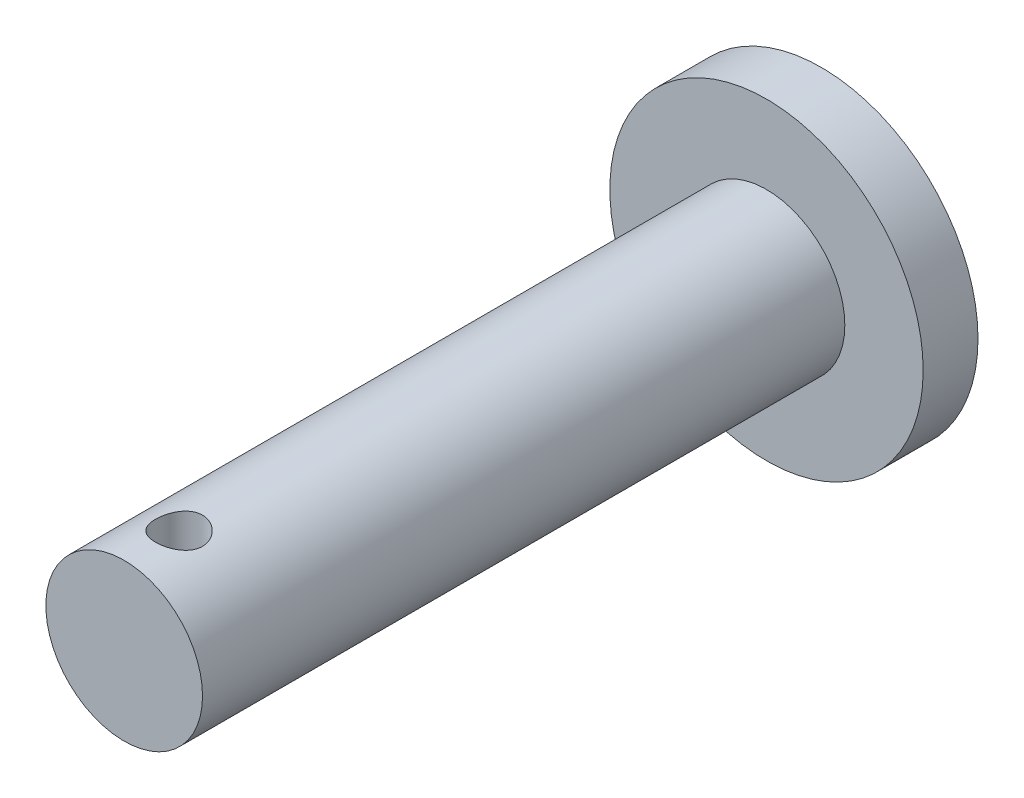
ISO-10303-21;
HEADER;
FILE_DESCRIPTION(('STEP AP214'),'2;1');
FILE_NAME('part.step','',(''),(''),'','','');
FILE_SCHEMA(('AUTOMOTIVE_DESIGN { 1 0 10303 214 1 1 1 1 }'));
ENDSEC;
DATA;
#1=APPLICATION_CONTEXT('core data for automotive mechanical design processes');
#2=APPLICATION_PROTOCOL_DEFINITION('international standard','automotive_design',2000,#1);
#3=PRODUCT_CONTEXT('',#1,'mechanical');
#4=PRODUCT('Part','Part','',(#3));
#5=PRODUCT_RELATED_PRODUCT_CATEGORY('part','',(#4));
#6=PRODUCT_DEFINITION_FORMATION('','',#4);
#7=PRODUCT_DEFINITION_CONTEXT('part definition',#1,'design');
#8=PRODUCT_DEFINITION('design','',#6,#7);
#9=PRODUCT_DEFINITION_SHAPE('','',#8);
#10=(LENGTH_UNIT() NAMED_UNIT(*) SI_UNIT(.MILLI.,.METRE.));
#11=(NAMED_UNIT(*) PLANE_ANGLE_UNIT() SI_UNIT($,.RADIAN.));
#12=(NAMED_UNIT(*) SI_UNIT($,.STERADIAN.) SOLID_ANGLE_UNIT());
#13=UNCERTAINTY_MEASURE_WITH_UNIT(LENGTH_MEASURE(1.E-05),#10,'distance_accuracy_value','');
#14=(GEOMETRIC_REPRESENTATION_CONTEXT(3) GLOBAL_UNCERTAINTY_ASSIGNED_CONTEXT((#13)) GLOBAL_UNIT_ASSIGNED_CONTEXT((#10,
#11,#12)) REPRESENTATION_CONTEXT('',''));
#15=CARTESIAN_POINT('',(0.,0.,0.));
#16=DIRECTION('',(0.,0.,1.));
#17=DIRECTION('',(1.,0.,0.));
#18=AXIS2_PLACEMENT_3D('',#15,#16,#17);
#19=CARTESIAN_POINT('',(0.,0.,7.));
#20=DIRECTION('',(0.,0.,-1.));
#21=DIRECTION('',(-1.,0.,0.));
#22=AXIS2_PLACEMENT_3D('',#19,#20,#21);
#23=CYLINDRICAL_SURFACE('',#22,20.);
#24=CARTESIAN_POINT('',(0.,0.,7.));
#25=DIRECTION('',(0.,0.,1.));
#26=DIRECTION('',(1.,0.,0.));
#27=AXIS2_PLACEMENT_3D('',#24,#25,#26);
#28=CIRCLE('',#27,20.);
#29=CARTESIAN_POINT('',(20.,0.,7.));
#30=VERTEX_POINT('',#29);
#31=EDGE_CURVE('E56',#30,#30,#28,.T.);
#32=ORIENTED_EDGE('',*,*,#31,.F.);
#33=EDGE_LOOP('',(#32));
#34=FACE_BOUND('',#33,.T.);
#35=CARTESIAN_POINT('',(0.,0.,0.));
#36=DIRECTION('',(0.,0.,1.));
#37=DIRECTION('',(1.,0.,0.));
#38=AXIS2_PLACEMENT_3D('',#35,#36,#37);
#39=CIRCLE('',#38,20.);
#40=CARTESIAN_POINT('',(20.,0.,0.));
#41=VERTEX_POINT('',#40);
#42=EDGE_CURVE('E62',#41,#41,#39,.T.);
#43=ORIENTED_EDGE('',*,*,#42,.T.);
#44=EDGE_LOOP('',(#43));
#45=FACE_BOUND('',#44,.T.);
#46=ADVANCED_FACE('F43',(#34,#45),#23,.T.);
#47=CARTESIAN_POINT('',(0.,0.,7.));
#48=DIRECTION('',(0.,0.,1.));
#49=DIRECTION('',(1.,0.,0.));
#50=AXIS2_PLACEMENT_3D('',#47,#48,#49);
#51=PLANE('',#50);
#52=CARTESIAN_POINT('',(0.,0.,7.));
#53=DIRECTION('',(0.,0.,1.));
#54=DIRECTION('',(1.,0.,0.));
#55=AXIS2_PLACEMENT_3D('',#52,#53,#54);
#56=CIRCLE('',#55,10.);
#57=CARTESIAN_POINT('',(10.,0.,7.));
#58=VERTEX_POINT('',#57);
#59=EDGE_CURVE('E10',#58,#58,#56,.T.);
#60=ORIENTED_EDGE('',*,*,#59,.F.);
#61=EDGE_LOOP('',(#60));
#62=FACE_BOUND('',#61,.T.);
#63=ORIENTED_EDGE('',*,*,#31,.T.);
#64=EDGE_LOOP('',(#63));
#65=FACE_BOUND('',#64,.T.);
#66=ADVANCED_FACE('F95',(#62,#65),#51,.T.);
#67=CARTESIAN_POINT('',(0.,0.,0.));
#68=DIRECTION('',(0.,0.,1.));
#69=DIRECTION('',(1.,0.,0.));
#70=AXIS2_PLACEMENT_3D('',#67,#68,#69);
#71=PLANE('',#70);
#72=ORIENTED_EDGE('',*,*,#42,.F.);
#73=EDGE_LOOP('',(#72));
#74=FACE_BOUND('',#73,.T.);
#75=ADVANCED_FACE('F91',(#74),#71,.F.);
#76=CARTESIAN_POINT('',(0.,0.,89.));
#77=DIRECTION('',(0.,0.,-1.));
#78=DIRECTION('',(-1.,0.,0.));
#79=AXIS2_PLACEMENT_3D('',#76,#77,#78);
#80=CYLINDRICAL_SURFACE('',#79,10.);
#81=CARTESIAN_POINT('',(0.,-10.,85.));
#82=CARTESIAN_POINT('',(0.1645772255066,-9.99999858501101,84.9999980050302));
#83=CARTESIAN_POINT('',(0.329174636703059,-9.99589831387907,84.9864122727521));
#84=CARTESIAN_POINT('',(0.653576250609762,-9.97994211187382,84.9325572915558));
#85=CARTESIAN_POINT('',(0.813379008822841,-9.96808386779384,84.8922800839533));
#86=CARTESIAN_POINT('',(1.12346541550905,-9.93791105003673,84.7865079661795));
#87=CARTESIAN_POINT('',(1.27376272879075,-9.91960600500851,84.7210502607621));
#88=CARTESIAN_POINT('',(1.56124836210626,-9.8784421847529,84.5669278138883));
#89=CARTESIAN_POINT('',(1.69843493493934,-9.85558280384133,84.4782599852092));
#90=CARTESIAN_POINT('',(1.95974359436749,-9.80701474385548,84.2775519850547));
#91=CARTESIAN_POINT('',(2.08343614248868,-9.78124767314072,84.1649667482282));
#92=CARTESIAN_POINT('',(2.31049841846648,-9.73011668420884,83.9207815401796));
#93=CARTESIAN_POINT('',(2.41386472654882,-9.70475283449003,83.7891783757501));
#94=CARTESIAN_POINT('',(2.59960075447415,-9.65668227987544,83.5070584939248));
#95=CARTESIAN_POINT('',(2.68144618044427,-9.63404813327749,83.3561830780185));
#96=CARTESIAN_POINT('',(2.81842789549521,-9.59487240788062,83.0420214915394));
#97=CARTESIAN_POINT('',(2.87357059839947,-9.57832936626621,82.8787383121441));
#98=CARTESIAN_POINT('',(2.95403267365303,-9.55381741676868,82.5492194677391));
#99=CARTESIAN_POINT('',(2.98014392469355,-9.54562138649067,82.3831945122721));
#100=CARTESIAN_POINT('',(3.00427461229344,-9.53805579499534,82.0489336875665));
#101=CARTESIAN_POINT('',(3.00230085522157,-9.53868409521142,81.8806983638818));
#102=CARTESIAN_POINT('',(2.97093954399623,-9.54849488135555,81.553232182783));
#103=CARTESIAN_POINT('',(2.94254410525371,-9.55736777198281,81.3938954992755));
#104=CARTESIAN_POINT('',(2.86074840854112,-9.58216712457248,81.0823604274531));
#105=CARTESIAN_POINT('',(2.80734568283282,-9.59809428264701,80.9301627452513));
#106=CARTESIAN_POINT('',(2.67632053307363,-9.63545466149946,80.6347993006785));
#107=CARTESIAN_POINT('',(2.59837633869285,-9.65696032231904,80.4917858320895));
#108=CARTESIAN_POINT('',(2.42070445177366,-9.70301974000129,80.2205359559796));
#109=CARTESIAN_POINT('',(2.32097148005177,-9.72757423493982,80.0923031411724));
#110=CARTESIAN_POINT('',(2.09762581531093,-9.77822022595874,79.848627618476));
#111=CARTESIAN_POINT('',(1.97318981493394,-9.80433308620996,79.7339426719407));
#112=CARTESIAN_POINT('',(1.70652651862793,-9.85424488126517,79.5268920318715));
#113=CARTESIAN_POINT('',(1.56429810372178,-9.8780436703682,79.4345277431711));
#114=CARTESIAN_POINT('',(1.26471007668561,-9.92086320138941,79.2742801550705));
#115=CARTESIAN_POINT('',(1.1072554994959,-9.93985087336628,79.2065649675003));
#116=CARTESIAN_POINT('',(0.782490831207038,-9.97067043664444,79.0988008198007));
#117=CARTESIAN_POINT('',(0.615183503179164,-9.98250432373999,79.058744142935));
#118=CARTESIAN_POINT('',(0.281904485336664,-9.99736729287077,79.0086956442012));
#119=CARTESIAN_POINT('',(0.116100195202373,-10.0006970083558,78.9976768283968));
#120=CARTESIAN_POINT('',(-0.214999211646769,-9.99905846483519,79.0031383114242));
#121=CARTESIAN_POINT('',(-0.380294393381566,-9.99409131355514,79.0196149393029));
#122=CARTESIAN_POINT('',(-0.701807210619398,-9.97661393974325,79.078769222223));
#123=CARTESIAN_POINT('',(-0.858145545228343,-9.96427659598829,79.1208467751618));
#124=CARTESIAN_POINT('',(-1.16150927790905,-9.9334869568307,79.2292864655564));
#125=CARTESIAN_POINT('',(-1.30853355405117,-9.91503392642188,79.2956515220757));
#126=CARTESIAN_POINT('',(-1.59287437892211,-9.87339308702631,79.4525063309623));
#127=CARTESIAN_POINT('',(-1.72988765239934,-9.8501056165928,79.543518681896));
#128=CARTESIAN_POINT('',(-1.9870466159603,-9.80146937528704,79.7464495081056));
#129=CARTESIAN_POINT('',(-2.10718806471189,-9.77612008862419,79.8583732237753));
#130=CARTESIAN_POINT('',(-2.33171489102053,-9.72506343738006,80.1047746167387));
#131=CARTESIAN_POINT('',(-2.43536962463002,-9.69937650065513,80.2399237515437));
#132=CARTESIAN_POINT('',(-2.61857990144313,-9.65153030477949,80.5262558780269));
#133=CARTESIAN_POINT('',(-2.69813607658965,-9.62937095313121,80.6774384491158));
#134=CARTESIAN_POINT('',(-2.83034694254316,-9.5913437922631,80.9910649825101));
#135=CARTESIAN_POINT('',(-2.88312693874022,-9.57544675673501,81.1534523730757));
#136=CARTESIAN_POINT('',(-2.96043461630307,-9.55183188739737,81.4853759378605));
#137=CARTESIAN_POINT('',(-2.98497197957849,-9.54411125069387,81.6549096415661));
#138=CARTESIAN_POINT('',(-3.0044396896993,-9.53799944941558,81.9887230367768));
#139=CARTESIAN_POINT('',(-3.00056110615887,-9.53923294700394,82.1529273020988));
#140=CARTESIAN_POINT('',(-2.9661501088861,-9.54998802392188,82.4782282068012));
#141=CARTESIAN_POINT('',(-2.93561876249408,-9.55950927135902,82.639324970361));
#142=CARTESIAN_POINT('',(-2.84953777608686,-9.58551527389243,82.9518907982634));
#143=CARTESIAN_POINT('',(-2.79430351014248,-9.60191209104934,83.1034545747174));
#144=CARTESIAN_POINT('',(-2.66063014242148,-9.63980557805265,83.3952848776414));
#145=CARTESIAN_POINT('',(-2.58218659925722,-9.6613032238508,83.5355492352831));
#146=CARTESIAN_POINT('',(-2.40097527610175,-9.70795352855338,83.8063262330525));
#147=CARTESIAN_POINT('',(-2.29742552185996,-9.7332108032858,83.9362975225204));
#148=CARTESIAN_POINT('',(-2.07034869259555,-9.78402640899066,84.1774049966162));
#149=CARTESIAN_POINT('',(-1.94681643426897,-9.80958481647543,84.2885362789357));
#150=CARTESIAN_POINT('',(-1.67893152436651,-9.85901873141573,84.4920468245899));
#151=CARTESIAN_POINT('',(-1.53407577158121,-9.88282319531422,84.583782893711));
#152=CARTESIAN_POINT('',(-1.23028274796705,-9.92521360911553,84.7414703398081));
#153=CARTESIAN_POINT('',(-1.07135210599791,-9.94380199862114,84.807433776549));
#154=CARTESIAN_POINT('',(-0.761515425310567,-9.97204349938619,84.9057905513055));
#155=CARTESIAN_POINT('',(-0.611573923908471,-9.9824405476214,84.9410233457665));
#156=CARTESIAN_POINT('',(-0.307760390461559,-9.9964188898898,84.9881270504832));
#157=CARTESIAN_POINT('',(-0.153889019716279,-10.0000013230948,85.0000018654097));
#158=CARTESIAN_POINT('',(0.,-10.,85.));
#159=B_SPLINE_CURVE_WITH_KNOTS('',3,(#81,#82,#83,#84,#85,#86,#87,#88,#89,#90,#91,#92,#93,#94,
#95,#96,#97,#98,#99,#100,#101,#102,#103,#104,#105,#106,#107,#108,#109,#110,#111,#112,#113,#114,
#115,#116,#117,#118,#119,#120,#121,#122,#123,#124,#125,#126,#127,#128,#129,#130,#131,#132,#133,
#134,#135,#136,#137,#138,#139,#140,#141,#142,#143,#144,#145,#146,#147,#148,#149,#150,#151,#152,
#153,#154,#155,#156,#157,#158),.UNSPECIFIED.,.T.,.F.,(4,2,2,2,2,2,2,2,2,2,2,2,2,2,2,2,2,2,2,2,2,
2,2,2,2,2,2,2,2,2,2,2,2,2,2,2,2,2,4),(0.,0.493166407225223,0.986479929692,1.47906735260175,
1.9717203288254,2.47711205896383,2.98258874577266,3.49942962008218,4.01614629086448,
4.51839378713198,5.02051956638178,5.50452033395353,5.98856887316004,6.4792485289424,
6.97004720317111,7.48134208096334,7.99266913062143,8.50742093763378,9.02202907057616,
9.51817618877091,10.0142570710065,10.4991349336465,10.9840710918746,11.4802261140582,
11.9765056400038,12.4908080064564,13.0050968850536,13.5169562990251,14.0286401892057,
14.5190031093854,15.0093463933232,15.4936008081456,15.9779479511534,16.4799385136898,
16.9820594980413,17.4988599232246,18.0154182319959,18.4766338387004,18.9377723390687),.UNSPECIFIED.);
#160=CARTESIAN_POINT('',(0.,-10.,85.));
#161=VERTEX_POINT('',#160);
#162=EDGE_CURVE('E46',#161,#161,#159,.T.);
#163=ORIENTED_EDGE('',*,*,#162,.T.);
#164=EDGE_LOOP('',(#163));
#165=FACE_BOUND('',#164,.T.);
#166=CARTESIAN_POINT('',(0.,10.,85.));
#167=CARTESIAN_POINT('',(-0.1645772255066,9.99999858501101,84.9999980050302));
#168=CARTESIAN_POINT('',(-0.329174636703059,9.99589831387907,84.9864122727521));
#169=CARTESIAN_POINT('',(-0.653576250609762,9.97994211187382,84.9325572915558));
#170=CARTESIAN_POINT('',(-0.813379008822841,9.96808386779384,84.8922800839533));
#171=CARTESIAN_POINT('',(-1.12346541550905,9.93791105003673,84.7865079661795));
#172=CARTESIAN_POINT('',(-1.27376272879075,9.91960600500851,84.7210502607621));
#173=CARTESIAN_POINT('',(-1.56124836210626,9.8784421847529,84.5669278138883));
#174=CARTESIAN_POINT('',(-1.69843493493934,9.85558280384133,84.4782599852092));
#175=CARTESIAN_POINT('',(-1.95974359436749,9.80701474385548,84.2775519850547));
#176=CARTESIAN_POINT('',(-2.08343614248868,9.78124767314072,84.1649667482282));
#177=CARTESIAN_POINT('',(-2.31049841846648,9.73011668420884,83.9207815401796));
#178=CARTESIAN_POINT('',(-2.41386472654882,9.70475283449003,83.7891783757501));
#179=CARTESIAN_POINT('',(-2.59960075447415,9.65668227987544,83.5070584939248));
#180=CARTESIAN_POINT('',(-2.68144618044427,9.63404813327749,83.3561830780185));
#181=CARTESIAN_POINT('',(-2.81842789549521,9.59487240788062,83.0420214915394));
#182=CARTESIAN_POINT('',(-2.87357059839947,9.57832936626621,82.8787383121441));
#183=CARTESIAN_POINT('',(-2.95403267365303,9.55381741676868,82.5492194677391));
#184=CARTESIAN_POINT('',(-2.98014392469355,9.54562138649067,82.3831945122721));
#185=CARTESIAN_POINT('',(-3.00427461229344,9.53805579499534,82.0489336875665));
#186=CARTESIAN_POINT('',(-3.00230085522157,9.53868409521142,81.8806983638818));
#187=CARTESIAN_POINT('',(-2.97093954399623,9.54849488135555,81.553232182783));
#188=CARTESIAN_POINT('',(-2.94254410525371,9.55736777198281,81.3938954992755));
#189=CARTESIAN_POINT('',(-2.86074840854112,9.58216712457248,81.0823604274531));
#190=CARTESIAN_POINT('',(-2.80734568283282,9.59809428264701,80.9301627452513));
#191=CARTESIAN_POINT('',(-2.67632053307363,9.63545466149946,80.6347993006785));
#192=CARTESIAN_POINT('',(-2.59837633869285,9.65696032231904,80.4917858320895));
#193=CARTESIAN_POINT('',(-2.42070445177366,9.70301974000129,80.2205359559796));
#194=CARTESIAN_POINT('',(-2.32097148005177,9.72757423493982,80.0923031411724));
#195=CARTESIAN_POINT('',(-2.09762581531093,9.77822022595874,79.848627618476));
#196=CARTESIAN_POINT('',(-1.97318981493394,9.80433308620996,79.7339426719407));
#197=CARTESIAN_POINT('',(-1.70652651862793,9.85424488126517,79.5268920318715));
#198=CARTESIAN_POINT('',(-1.56429810372178,9.8780436703682,79.4345277431711));
#199=CARTESIAN_POINT('',(-1.26471007668561,9.92086320138941,79.2742801550705));
#200=CARTESIAN_POINT('',(-1.1072554994959,9.93985087336628,79.2065649675003));
#201=CARTESIAN_POINT('',(-0.782490831207038,9.97067043664444,79.0988008198007));
#202=CARTESIAN_POINT('',(-0.615183503179164,9.98250432373999,79.058744142935));
#203=CARTESIAN_POINT('',(-0.281904485336664,9.99736729287077,79.0086956442012));
#204=CARTESIAN_POINT('',(-0.116100195202373,10.0006970083558,78.9976768283968));
#205=CARTESIAN_POINT('',(0.214999211646769,9.99905846483519,79.0031383114242));
#206=CARTESIAN_POINT('',(0.380294393381566,9.99409131355514,79.0196149393029));
#207=CARTESIAN_POINT('',(0.701807210619398,9.97661393974325,79.078769222223));
#208=CARTESIAN_POINT('',(0.858145545228343,9.96427659598829,79.1208467751618));
#209=CARTESIAN_POINT('',(1.16150927790905,9.9334869568307,79.2292864655564));
#210=CARTESIAN_POINT('',(1.30853355405117,9.91503392642188,79.2956515220757));
#211=CARTESIAN_POINT('',(1.59287437892211,9.87339308702631,79.4525063309623));
#212=CARTESIAN_POINT('',(1.72988765239934,9.8501056165928,79.543518681896));
#213=CARTESIAN_POINT('',(1.9870466159603,9.80146937528704,79.7464495081056));
#214=CARTESIAN_POINT('',(2.10718806471189,9.77612008862419,79.8583732237753));
#215=CARTESIAN_POINT('',(2.33171489102053,9.72506343738006,80.1047746167387));
#216=CARTESIAN_POINT('',(2.43536962463002,9.69937650065513,80.2399237515437));
#217=CARTESIAN_POINT('',(2.61857990144313,9.65153030477949,80.5262558780269));
#218=CARTESIAN_POINT('',(2.69813607658965,9.62937095313121,80.6774384491158));
#219=CARTESIAN_POINT('',(2.83034694254316,9.5913437922631,80.9910649825101));
#220=CARTESIAN_POINT('',(2.88312693874022,9.57544675673501,81.1534523730757));
#221=CARTESIAN_POINT('',(2.96043461630307,9.55183188739737,81.4853759378605));
#222=CARTESIAN_POINT('',(2.98497197957849,9.54411125069387,81.6549096415661));
#223=CARTESIAN_POINT('',(3.0044396896993,9.53799944941558,81.9887230367768));
#224=CARTESIAN_POINT('',(3.00056110615887,9.53923294700394,82.1529273020988));
#225=CARTESIAN_POINT('',(2.9661501088861,9.54998802392188,82.4782282068012));
#226=CARTESIAN_POINT('',(2.93561876249408,9.55950927135902,82.639324970361));
#227=CARTESIAN_POINT('',(2.84953777608686,9.58551527389243,82.9518907982634));
#228=CARTESIAN_POINT('',(2.79430351014248,9.60191209104934,83.1034545747174));
#229=CARTESIAN_POINT('',(2.66063014242148,9.63980557805265,83.3952848776414));
#230=CARTESIAN_POINT('',(2.58218659925722,9.6613032238508,83.5355492352831));
#231=CARTESIAN_POINT('',(2.40097527610175,9.70795352855338,83.8063262330525));
#232=CARTESIAN_POINT('',(2.29742552185996,9.7332108032858,83.9362975225204));
#233=CARTESIAN_POINT('',(2.07034869259555,9.78402640899066,84.1774049966162));
#234=CARTESIAN_POINT('',(1.94681643426897,9.80958481647543,84.2885362789357));
#235=CARTESIAN_POINT('',(1.67893152436651,9.85901873141573,84.4920468245899));
#236=CARTESIAN_POINT('',(1.53407577158121,9.88282319531422,84.583782893711));
#237=CARTESIAN_POINT('',(1.23028274796705,9.92521360911553,84.7414703398081));
#238=CARTESIAN_POINT('',(1.07135210599791,9.94380199862114,84.807433776549));
#239=CARTESIAN_POINT('',(0.761515425310567,9.97204349938619,84.9057905513055));
#240=CARTESIAN_POINT('',(0.611573923908471,9.9824405476214,84.9410233457665));
#241=CARTESIAN_POINT('',(0.307760390461559,9.9964188898898,84.9881270504832));
#242=CARTESIAN_POINT('',(0.153889019716279,10.0000013230948,85.0000018654097));
#243=CARTESIAN_POINT('',(0.,10.,85.));
#244=B_SPLINE_CURVE_WITH_KNOTS('',3,(#166,#167,#168,#169,#170,#171,#172,#173,#174,#175,#176,
#177,#178,#179,#180,#181,#182,#183,#184,#185,#186,#187,#188,#189,#190,#191,#192,#193,#194,#195,
#196,#197,#198,#199,#200,#201,#202,#203,#204,#205,#206,#207,#208,#209,#210,#211,#212,#213,#214,
#215,#216,#217,#218,#219,#220,#221,#222,#223,#224,#225,#226,#227,#228,#229,#230,#231,#232,#233,
#234,#235,#236,#237,#238,#239,#240,#241,#242,#243),.UNSPECIFIED.,.T.,.F.,(4,2,2,2,2,2,2,2,2,2,2,
2,2,2,2,2,2,2,2,2,2,2,2,2,2,2,2,2,2,2,2,2,2,2,2,2,2,2,4),(0.,0.493166407225223,0.986479929692,
1.47906735260175,1.9717203288254,2.47711205896383,2.98258874577266,3.49942962008218,
4.01614629086448,4.51839378713198,5.02051956638178,5.50452033395353,5.98856887316004,
6.4792485289424,6.97004720317111,7.48134208096334,7.99266913062143,8.50742093763378,
9.02202907057616,9.51817618877091,10.0142570710065,10.4991349336465,10.9840710918746,
11.4802261140582,11.9765056400038,12.4908080064564,13.0050968850536,13.5169562990251,
14.0286401892057,14.5190031093854,15.0093463933232,15.4936008081456,15.9779479511534,
16.4799385136898,16.9820594980413,17.4988599232246,18.0154182319959,18.4766338387004,
18.9377723390687),.UNSPECIFIED.);
#245=CARTESIAN_POINT('',(0.,10.,85.));
#246=VERTEX_POINT('',#245);
#247=EDGE_CURVE('E69',#246,#246,#244,.T.);
#248=ORIENTED_EDGE('',*,*,#247,.T.);
#249=EDGE_LOOP('',(#248));
#250=FACE_BOUND('',#249,.T.);
#251=CARTESIAN_POINT('',(0.,0.,89.));
#252=DIRECTION('',(0.,0.,1.));
#253=DIRECTION('',(1.,0.,0.));
#254=AXIS2_PLACEMENT_3D('',#251,#252,#253);
#255=CIRCLE('',#254,10.);
#256=CARTESIAN_POINT('',(10.,0.,89.));
#257=VERTEX_POINT('',#256);
#258=EDGE_CURVE('E65',#257,#257,#255,.T.);
#259=ORIENTED_EDGE('',*,*,#258,.F.);
#260=EDGE_LOOP('',(#259));
#261=FACE_BOUND('',#260,.T.);
#262=ORIENTED_EDGE('',*,*,#59,.T.);
#263=EDGE_LOOP('',(#262));
#264=FACE_BOUND('',#263,.T.);
#265=ADVANCED_FACE('F75',(#165,#250,#261,#264),#80,.T.);
#266=CARTESIAN_POINT('',(0.,0.,89.));
#267=DIRECTION('',(0.,0.,1.));
#268=DIRECTION('',(1.,0.,0.));
#269=AXIS2_PLACEMENT_3D('',#266,#267,#268);
#270=PLANE('',#269);
#271=ORIENTED_EDGE('',*,*,#258,.T.);
#272=EDGE_LOOP('',(#271));
#273=FACE_BOUND('',#272,.T.);
#274=ADVANCED_FACE('F82',(#273),#270,.T.);
#275=CARTESIAN_POINT('',(0.,-41.,82.));
#276=DIRECTION('',(0.,1.,0.));
#277=DIRECTION('',(0.,0.,1.));
#278=AXIS2_PLACEMENT_3D('',#275,#276,#277);
#279=CYLINDRICAL_SURFACE('',#278,3.);
#280=ORIENTED_EDGE('',*,*,#247,.F.);
#281=EDGE_LOOP('',(#280));
#282=FACE_BOUND('',#281,.T.);
#283=ORIENTED_EDGE('',*,*,#162,.F.);
#284=EDGE_LOOP('',(#283));
#285=FACE_BOUND('',#284,.T.);
#286=ADVANCED_FACE('F79',(#282,#285),#279,.F.);
#287=CLOSED_SHELL('',(#46,#66,#75,#265,#274,#286));
#288=MANIFOLD_SOLID_BREP('B2',#287);
#289=ADVANCED_BREP_SHAPE_REPRESENTATION('',(#18,#288),#14);
#290=SHAPE_DEFINITION_REPRESENTATION(#9,#289);
ENDSEC;
END-ISO-10303-21;
